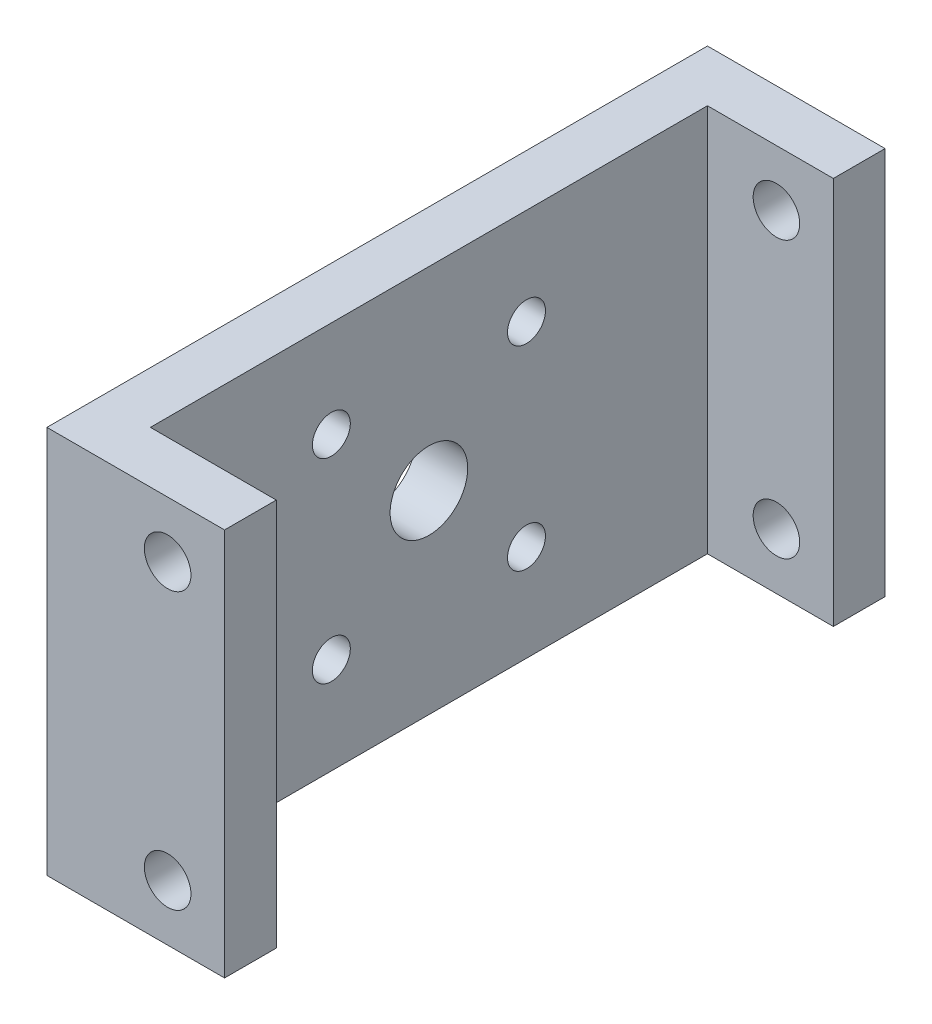
ISO-10303-21;
HEADER;
FILE_DESCRIPTION(('STEP AP214'),'2;1');
FILE_NAME('part.step','',(''),(''),'','','');
FILE_SCHEMA(('AUTOMOTIVE_DESIGN { 1 0 10303 214 1 1 1 1 }'));
ENDSEC;
DATA;
#1=APPLICATION_CONTEXT('core data for automotive mechanical design processes');
#2=APPLICATION_PROTOCOL_DEFINITION('international standard','automotive_design',2000,#1);
#3=PRODUCT_CONTEXT('',#1,'mechanical');
#4=PRODUCT('Part','Part','',(#3));
#5=PRODUCT_RELATED_PRODUCT_CATEGORY('part','',(#4));
#6=PRODUCT_DEFINITION_FORMATION('','',#4);
#7=PRODUCT_DEFINITION_CONTEXT('part definition',#1,'design');
#8=PRODUCT_DEFINITION('design','',#6,#7);
#9=PRODUCT_DEFINITION_SHAPE('','',#8);
#10=(LENGTH_UNIT() NAMED_UNIT(*) SI_UNIT(.MILLI.,.METRE.));
#11=(NAMED_UNIT(*) PLANE_ANGLE_UNIT() SI_UNIT($,.RADIAN.));
#12=(NAMED_UNIT(*) SI_UNIT($,.STERADIAN.) SOLID_ANGLE_UNIT());
#13=UNCERTAINTY_MEASURE_WITH_UNIT(LENGTH_MEASURE(1.E-05),#10,'distance_accuracy_value','');
#14=(GEOMETRIC_REPRESENTATION_CONTEXT(3) GLOBAL_UNCERTAINTY_ASSIGNED_CONTEXT((#13)) GLOBAL_UNIT_ASSIGNED_CONTEXT((#10,
#11,#12)) REPRESENTATION_CONTEXT('',''));
#15=CARTESIAN_POINT('',(0.,0.,0.));
#16=DIRECTION('',(0.,0.,1.));
#17=DIRECTION('',(1.,0.,0.));
#18=AXIS2_PLACEMENT_3D('',#15,#16,#17);
#19=CARTESIAN_POINT('',(3.,11.25,0.));
#20=DIRECTION('',(0.,1.,0.));
#21=DIRECTION('',(0.,0.,1.));
#22=AXIS2_PLACEMENT_3D('',#19,#20,#21);
#23=PLANE('',#22);
#24=DIRECTION('',(0.,0.,-1.));
#25=VECTOR('',#24,1.);
#26=CARTESIAN_POINT('',(0.,11.25,0.));
#27=LINE('',#26,#25);
#28=CARTESIAN_POINT('',(0.,11.25,19.15));
#29=VERTEX_POINT('',#28);
#30=CARTESIAN_POINT('',(0.,11.25,-19.15));
#31=VERTEX_POINT('',#30);
#32=EDGE_CURVE('E189',#29,#31,#27,.T.);
#33=ORIENTED_EDGE('',*,*,#32,.F.);
#34=DIRECTION('',(-1.,0.,0.));
#35=VECTOR('',#34,1.);
#36=CARTESIAN_POINT('',(10.3,11.25,19.15));
#37=LINE('',#36,#35);
#38=CARTESIAN_POINT('',(10.3,11.25,19.15));
#39=VERTEX_POINT('',#38);
#40=EDGE_CURVE('E396',#39,#29,#37,.T.);
#41=ORIENTED_EDGE('',*,*,#40,.F.);
#42=DIRECTION('',(0.,0.,-1.));
#43=VECTOR('',#42,1.);
#44=CARTESIAN_POINT('',(10.3,11.25,0.));
#45=LINE('',#44,#43);
#46=CARTESIAN_POINT('',(10.3,11.25,16.15));
#47=VERTEX_POINT('',#46);
#48=EDGE_CURVE('E118',#39,#47,#45,.T.);
#49=ORIENTED_EDGE('',*,*,#48,.T.);
#50=DIRECTION('',(-1.,0.,0.));
#51=VECTOR('',#50,1.);
#52=CARTESIAN_POINT('',(10.3,11.25,16.15));
#53=LINE('',#52,#51);
#54=CARTESIAN_POINT('',(3.,11.25,16.15));
#55=VERTEX_POINT('',#54);
#56=EDGE_CURVE('E130',#47,#55,#53,.T.);
#57=ORIENTED_EDGE('',*,*,#56,.T.);
#58=DIRECTION('',(0.,0.,-1.));
#59=VECTOR('',#58,1.);
#60=CARTESIAN_POINT('',(3.,11.25,0.));
#61=LINE('',#60,#59);
#62=CARTESIAN_POINT('',(3.,11.25,-16.15));
#63=VERTEX_POINT('',#62);
#64=EDGE_CURVE('E172',#55,#63,#61,.T.);
#65=ORIENTED_EDGE('',*,*,#64,.T.);
#66=DIRECTION('',(-1.,0.,0.));
#67=VECTOR('',#66,1.);
#68=CARTESIAN_POINT('',(10.3,11.25,-16.15));
#69=LINE('',#68,#67);
#70=CARTESIAN_POINT('',(10.3,11.25,-16.15));
#71=VERTEX_POINT('',#70);
#72=EDGE_CURVE('E152',#71,#63,#69,.T.);
#73=ORIENTED_EDGE('',*,*,#72,.F.);
#74=DIRECTION('',(0.,0.,-1.));
#75=VECTOR('',#74,1.);
#76=CARTESIAN_POINT('',(10.3,11.25,0.));
#77=LINE('',#76,#75);
#78=CARTESIAN_POINT('',(10.3,11.25,-19.15));
#79=VERTEX_POINT('',#78);
#80=EDGE_CURVE('E128',#71,#79,#77,.T.);
#81=ORIENTED_EDGE('',*,*,#80,.T.);
#82=DIRECTION('',(-1.,0.,0.));
#83=VECTOR('',#82,1.);
#84=CARTESIAN_POINT('',(10.3,11.25,-19.15));
#85=LINE('',#84,#83);
#86=EDGE_CURVE('E142',#79,#31,#85,.T.);
#87=ORIENTED_EDGE('',*,*,#86,.T.);
#88=EDGE_LOOP('',(#33,#41,#49,#57,#65,#73,#81,#87));
#89=FACE_BOUND('',#88,.T.);
#90=ADVANCED_FACE('F36',(#89),#23,.T.);
#91=CARTESIAN_POINT('',(3.,5.65685424949235,-5.65685424949241));
#92=DIRECTION('',(-1.,0.,0.));
#93=DIRECTION('',(0.,0.,1.));
#94=AXIS2_PLACEMENT_3D('',#91,#92,#93);
#95=CYLINDRICAL_SURFACE('',#94,1.1);
#96=CARTESIAN_POINT('',(3.,5.65685424949235,-5.65685424949241));
#97=DIRECTION('',(1.,0.,0.));
#98=DIRECTION('',(0.,0.,-1.));
#99=AXIS2_PLACEMENT_3D('',#96,#97,#98);
#100=CIRCLE('',#99,1.1);
#101=CARTESIAN_POINT('',(3.,5.65685424949235,-6.75685424949241));
#102=VERTEX_POINT('',#101);
#103=EDGE_CURVE('E168',#102,#102,#100,.T.);
#104=ORIENTED_EDGE('',*,*,#103,.T.);
#105=EDGE_LOOP('',(#104));
#106=FACE_BOUND('',#105,.T.);
#107=CARTESIAN_POINT('',(0.,5.65685424949235,-5.65685424949241));
#108=DIRECTION('',(1.,0.,0.));
#109=DIRECTION('',(0.,0.,-1.));
#110=AXIS2_PLACEMENT_3D('',#107,#108,#109);
#111=CIRCLE('',#110,1.1);
#112=CARTESIAN_POINT('',(0.,5.65685424949235,-6.75685424949241));
#113=VERTEX_POINT('',#112);
#114=EDGE_CURVE('E187',#113,#113,#111,.T.);
#115=ORIENTED_EDGE('',*,*,#114,.F.);
#116=EDGE_LOOP('',(#115));
#117=FACE_BOUND('',#116,.T.);
#118=ADVANCED_FACE('F214',(#106,#117),#95,.F.);
#119=CARTESIAN_POINT('',(3.,0.,0.));
#120=DIRECTION('',(-1.,0.,0.));
#121=DIRECTION('',(0.,0.,1.));
#122=AXIS2_PLACEMENT_3D('',#119,#120,#121);
#123=CYLINDRICAL_SURFACE('',#122,2.25);
#124=CARTESIAN_POINT('',(3.,0.,0.));
#125=DIRECTION('',(1.,0.,0.));
#126=DIRECTION('',(0.,0.,-1.));
#127=AXIS2_PLACEMENT_3D('',#124,#125,#126);
#128=CIRCLE('',#127,2.25);
#129=CARTESIAN_POINT('',(3.,0.,-2.25));
#130=VERTEX_POINT('',#129);
#131=EDGE_CURVE('E165',#130,#130,#128,.T.);
#132=ORIENTED_EDGE('',*,*,#131,.T.);
#133=EDGE_LOOP('',(#132));
#134=FACE_BOUND('',#133,.T.);
#135=CARTESIAN_POINT('',(0.,0.,0.));
#136=DIRECTION('',(1.,0.,0.));
#137=DIRECTION('',(0.,0.,-1.));
#138=AXIS2_PLACEMENT_3D('',#135,#136,#137);
#139=CIRCLE('',#138,2.25);
#140=CARTESIAN_POINT('',(0.,0.,-2.25));
#141=VERTEX_POINT('',#140);
#142=EDGE_CURVE('E184',#141,#141,#139,.T.);
#143=ORIENTED_EDGE('',*,*,#142,.F.);
#144=EDGE_LOOP('',(#143));
#145=FACE_BOUND('',#144,.T.);
#146=ADVANCED_FACE('F220',(#134,#145),#123,.F.);
#147=CARTESIAN_POINT('',(3.,-5.65685424949241,-5.65685424949266));
#148=DIRECTION('',(-1.,0.,0.));
#149=DIRECTION('',(0.,0.,1.));
#150=AXIS2_PLACEMENT_3D('',#147,#148,#149);
#151=CYLINDRICAL_SURFACE('',#150,1.1);
#152=CARTESIAN_POINT('',(3.,-5.65685424949241,-5.65685424949266));
#153=DIRECTION('',(1.,0.,0.));
#154=DIRECTION('',(0.,0.,-1.));
#155=AXIS2_PLACEMENT_3D('',#152,#153,#154);
#156=CIRCLE('',#155,1.1);
#157=CARTESIAN_POINT('',(3.,-5.65685424949241,-6.75685424949266));
#158=VERTEX_POINT('',#157);
#159=EDGE_CURVE('E162',#158,#158,#156,.T.);
#160=ORIENTED_EDGE('',*,*,#159,.T.);
#161=EDGE_LOOP('',(#160));
#162=FACE_BOUND('',#161,.T.);
#163=CARTESIAN_POINT('',(0.,-5.65685424949241,-5.65685424949266));
#164=DIRECTION('',(1.,0.,0.));
#165=DIRECTION('',(0.,0.,-1.));
#166=AXIS2_PLACEMENT_3D('',#163,#164,#165);
#167=CIRCLE('',#166,1.1);
#168=CARTESIAN_POINT('',(0.,-5.65685424949241,-6.75685424949266));
#169=VERTEX_POINT('',#168);
#170=EDGE_CURVE('E181',#169,#169,#167,.T.);
#171=ORIENTED_EDGE('',*,*,#170,.F.);
#172=EDGE_LOOP('',(#171));
#173=FACE_BOUND('',#172,.T.);
#174=ADVANCED_FACE('F226',(#162,#173),#151,.F.);
#175=CARTESIAN_POINT('',(3.,-5.65685424949266,5.6568542494921));
#176=DIRECTION('',(-1.,0.,0.));
#177=DIRECTION('',(0.,0.,1.));
#178=AXIS2_PLACEMENT_3D('',#175,#176,#177);
#179=CYLINDRICAL_SURFACE('',#178,1.1);
#180=CARTESIAN_POINT('',(3.,-5.65685424949266,5.6568542494921));
#181=DIRECTION('',(1.,0.,0.));
#182=DIRECTION('',(0.,0.,-1.));
#183=AXIS2_PLACEMENT_3D('',#180,#181,#182);
#184=CIRCLE('',#183,1.1);
#185=CARTESIAN_POINT('',(3.,-5.65685424949266,4.5568542494921));
#186=VERTEX_POINT('',#185);
#187=EDGE_CURVE('E159',#186,#186,#184,.T.);
#188=ORIENTED_EDGE('',*,*,#187,.T.);
#189=EDGE_LOOP('',(#188));
#190=FACE_BOUND('',#189,.T.);
#191=CARTESIAN_POINT('',(0.,-5.65685424949266,5.6568542494921));
#192=DIRECTION('',(1.,0.,0.));
#193=DIRECTION('',(0.,0.,-1.));
#194=AXIS2_PLACEMENT_3D('',#191,#192,#193);
#195=CIRCLE('',#194,1.1);
#196=CARTESIAN_POINT('',(0.,-5.65685424949266,4.5568542494921));
#197=VERTEX_POINT('',#196);
#198=EDGE_CURVE('E178',#197,#197,#195,.T.);
#199=ORIENTED_EDGE('',*,*,#198,.F.);
#200=EDGE_LOOP('',(#199));
#201=FACE_BOUND('',#200,.T.);
#202=ADVANCED_FACE('F229',(#190,#201),#179,.F.);
#203=CARTESIAN_POINT('',(3.,5.6568542494921,5.65685424949235));
#204=DIRECTION('',(-1.,0.,0.));
#205=DIRECTION('',(0.,0.,1.));
#206=AXIS2_PLACEMENT_3D('',#203,#204,#205);
#207=CYLINDRICAL_SURFACE('',#206,1.1);
#208=CARTESIAN_POINT('',(3.,5.6568542494921,5.65685424949235));
#209=DIRECTION('',(1.,0.,0.));
#210=DIRECTION('',(0.,0.,-1.));
#211=AXIS2_PLACEMENT_3D('',#208,#209,#210);
#212=CIRCLE('',#211,1.1);
#213=CARTESIAN_POINT('',(3.,5.6568542494921,4.55685424949235));
#214=VERTEX_POINT('',#213);
#215=EDGE_CURVE('E156',#214,#214,#212,.T.);
#216=ORIENTED_EDGE('',*,*,#215,.T.);
#217=EDGE_LOOP('',(#216));
#218=FACE_BOUND('',#217,.T.);
#219=CARTESIAN_POINT('',(0.,5.6568542494921,5.65685424949235));
#220=DIRECTION('',(1.,0.,0.));
#221=DIRECTION('',(0.,0.,-1.));
#222=AXIS2_PLACEMENT_3D('',#219,#220,#221);
#223=CIRCLE('',#222,1.1);
#224=CARTESIAN_POINT('',(0.,5.6568542494921,4.55685424949235));
#225=VERTEX_POINT('',#224);
#226=EDGE_CURVE('E155',#225,#225,#223,.T.);
#227=ORIENTED_EDGE('',*,*,#226,.F.);
#228=EDGE_LOOP('',(#227));
#229=FACE_BOUND('',#228,.T.);
#230=ADVANCED_FACE('F38',(#218,#229),#207,.F.);
#231=CARTESIAN_POINT('',(3.,-11.25,0.));
#232=DIRECTION('',(0.,1.,0.));
#233=DIRECTION('',(0.,0.,1.));
#234=AXIS2_PLACEMENT_3D('',#231,#232,#233);
#235=PLANE('',#234);
#236=DIRECTION('',(0.,0.,-1.));
#237=VECTOR('',#236,1.);
#238=CARTESIAN_POINT('',(0.,-11.25,0.));
#239=LINE('',#238,#237);
#240=CARTESIAN_POINT('',(0.,-11.25,19.15));
#241=VERTEX_POINT('',#240);
#242=CARTESIAN_POINT('',(0.,-11.25,-19.15));
#243=VERTEX_POINT('',#242);
#244=EDGE_CURVE('E40',#241,#243,#239,.T.);
#245=ORIENTED_EDGE('',*,*,#244,.T.);
#246=DIRECTION('',(-1.,0.,0.));
#247=VECTOR('',#246,1.);
#248=CARTESIAN_POINT('',(10.3,-11.25,-19.15));
#249=LINE('',#248,#247);
#250=CARTESIAN_POINT('',(10.3,-11.25,-19.15));
#251=VERTEX_POINT('',#250);
#252=EDGE_CURVE('E146',#251,#243,#249,.T.);
#253=ORIENTED_EDGE('',*,*,#252,.F.);
#254=DIRECTION('',(0.,0.,-1.));
#255=VECTOR('',#254,1.);
#256=CARTESIAN_POINT('',(10.3,-11.25,0.));
#257=LINE('',#256,#255);
#258=CARTESIAN_POINT('',(10.3,-11.25,-16.15));
#259=VERTEX_POINT('',#258);
#260=EDGE_CURVE('E138',#259,#251,#257,.T.);
#261=ORIENTED_EDGE('',*,*,#260,.F.);
#262=DIRECTION('',(-1.,0.,0.));
#263=VECTOR('',#262,1.);
#264=CARTESIAN_POINT('',(10.3,-11.25,-16.15));
#265=LINE('',#264,#263);
#266=CARTESIAN_POINT('',(3.,-11.25,-16.15));
#267=VERTEX_POINT('',#266);
#268=EDGE_CURVE('E149',#259,#267,#265,.T.);
#269=ORIENTED_EDGE('',*,*,#268,.T.);
#270=DIRECTION('',(0.,0.,-1.));
#271=VECTOR('',#270,1.);
#272=CARTESIAN_POINT('',(3.,-11.25,0.));
#273=LINE('',#272,#271);
#274=CARTESIAN_POINT('',(3.,-11.25,16.15));
#275=VERTEX_POINT('',#274);
#276=EDGE_CURVE('E11',#275,#267,#273,.T.);
#277=ORIENTED_EDGE('',*,*,#276,.F.);
#278=DIRECTION('',(-1.,0.,0.));
#279=VECTOR('',#278,1.);
#280=CARTESIAN_POINT('',(10.3,-11.25,16.15));
#281=LINE('',#280,#279);
#282=CARTESIAN_POINT('',(10.3,-11.25,16.15));
#283=VERTEX_POINT('',#282);
#284=EDGE_CURVE('E53',#283,#275,#281,.T.);
#285=ORIENTED_EDGE('',*,*,#284,.F.);
#286=DIRECTION('',(0.,0.,-1.));
#287=VECTOR('',#286,1.);
#288=CARTESIAN_POINT('',(10.3,-11.25,0.));
#289=LINE('',#288,#287);
#290=CARTESIAN_POINT('',(10.3,-11.25,19.15));
#291=VERTEX_POINT('',#290);
#292=EDGE_CURVE('E103',#291,#283,#289,.T.);
#293=ORIENTED_EDGE('',*,*,#292,.F.);
#294=DIRECTION('',(-1.,0.,0.));
#295=VECTOR('',#294,1.);
#296=CARTESIAN_POINT('',(10.3,-11.25,19.15));
#297=LINE('',#296,#295);
#298=EDGE_CURVE('E107',#291,#241,#297,.T.);
#299=ORIENTED_EDGE('',*,*,#298,.T.);
#300=EDGE_LOOP('',(#245,#253,#261,#269,#277,#285,#293,#299));
#301=FACE_BOUND('',#300,.T.);
#302=ADVANCED_FACE('F105',(#301),#235,.F.);
#303=CARTESIAN_POINT('',(3.,0.,0.));
#304=DIRECTION('',(1.,0.,0.));
#305=DIRECTION('',(0.,0.,-1.));
#306=AXIS2_PLACEMENT_3D('',#303,#304,#305);
#307=PLANE('',#306);
#308=ORIENTED_EDGE('',*,*,#215,.F.);
#309=EDGE_LOOP('',(#308));
#310=FACE_BOUND('',#309,.T.);
#311=ORIENTED_EDGE('',*,*,#187,.F.);
#312=EDGE_LOOP('',(#311));
#313=FACE_BOUND('',#312,.T.);
#314=ORIENTED_EDGE('',*,*,#159,.F.);
#315=EDGE_LOOP('',(#314));
#316=FACE_BOUND('',#315,.T.);
#317=ORIENTED_EDGE('',*,*,#131,.F.);
#318=EDGE_LOOP('',(#317));
#319=FACE_BOUND('',#318,.T.);
#320=ORIENTED_EDGE('',*,*,#103,.F.);
#321=EDGE_LOOP('',(#320));
#322=FACE_BOUND('',#321,.T.);
#323=DIRECTION('',(0.,-1.,0.));
#324=VECTOR('',#323,1.);
#325=CARTESIAN_POINT('',(3.,0.,-16.15));
#326=LINE('',#325,#324);
#327=EDGE_CURVE('E60',#63,#267,#326,.T.);
#328=ORIENTED_EDGE('',*,*,#327,.F.);
#329=ORIENTED_EDGE('',*,*,#64,.F.);
#330=DIRECTION('',(0.,-1.,0.));
#331=VECTOR('',#330,1.);
#332=CARTESIAN_POINT('',(3.,0.,16.15));
#333=LINE('',#332,#331);
#334=EDGE_CURVE('E45',#55,#275,#333,.T.);
#335=ORIENTED_EDGE('',*,*,#334,.T.);
#336=ORIENTED_EDGE('',*,*,#276,.T.);
#337=EDGE_LOOP('',(#328,#329,#335,#336));
#338=FACE_BOUND('',#337,.T.);
#339=ADVANCED_FACE('F200',(#310,#313,#316,#319,#322,#338),#307,.T.);
#340=CARTESIAN_POINT('',(0.,0.,0.));
#341=DIRECTION('',(1.,0.,0.));
#342=DIRECTION('',(0.,0.,-1.));
#343=AXIS2_PLACEMENT_3D('',#340,#341,#342);
#344=PLANE('',#343);
#345=ORIENTED_EDGE('',*,*,#226,.T.);
#346=EDGE_LOOP('',(#345));
#347=FACE_BOUND('',#346,.T.);
#348=ORIENTED_EDGE('',*,*,#198,.T.);
#349=EDGE_LOOP('',(#348));
#350=FACE_BOUND('',#349,.T.);
#351=ORIENTED_EDGE('',*,*,#170,.T.);
#352=EDGE_LOOP('',(#351));
#353=FACE_BOUND('',#352,.T.);
#354=ORIENTED_EDGE('',*,*,#142,.T.);
#355=EDGE_LOOP('',(#354));
#356=FACE_BOUND('',#355,.T.);
#357=ORIENTED_EDGE('',*,*,#114,.T.);
#358=EDGE_LOOP('',(#357));
#359=FACE_BOUND('',#358,.T.);
#360=ORIENTED_EDGE('',*,*,#32,.T.);
#361=DIRECTION('',(0.,-1.,0.));
#362=VECTOR('',#361,1.);
#363=CARTESIAN_POINT('',(0.,0.,-19.15));
#364=LINE('',#363,#362);
#365=EDGE_CURVE('E125',#31,#243,#364,.T.);
#366=ORIENTED_EDGE('',*,*,#365,.T.);
#367=ORIENTED_EDGE('',*,*,#244,.F.);
#368=DIRECTION('',(0.,-1.,0.));
#369=VECTOR('',#368,1.);
#370=CARTESIAN_POINT('',(0.,0.,19.15));
#371=LINE('',#370,#369);
#372=EDGE_CURVE('E121',#29,#241,#371,.T.);
#373=ORIENTED_EDGE('',*,*,#372,.F.);
#374=EDGE_LOOP('',(#360,#366,#367,#373));
#375=FACE_BOUND('',#374,.T.);
#376=ADVANCED_FACE('F197',(#347,#350,#353,#356,#359,#375),#344,.F.);
#377=CARTESIAN_POINT('',(10.3,0.,-16.15));
#378=DIRECTION('',(0.,0.,-1.));
#379=DIRECTION('',(0.,1.,0.));
#380=AXIS2_PLACEMENT_3D('',#377,#378,#379);
#381=PLANE('',#380);
#382=CARTESIAN_POINT('',(7.,-8.,-16.15));
#383=DIRECTION('',(0.,0.,-1.));
#384=DIRECTION('',(0.,1.,0.));
#385=AXIS2_PLACEMENT_3D('',#382,#383,#384);
#386=CIRCLE('',#385,1.35);
#387=CARTESIAN_POINT('',(8.35,-8.,-16.15));
#388=VERTEX_POINT('',#387);
#389=EDGE_CURVE('E375',#388,#388,#386,.F.);
#390=ORIENTED_EDGE('',*,*,#389,.F.);
#391=EDGE_LOOP('',(#390));
#392=FACE_BOUND('',#391,.T.);
#393=CARTESIAN_POINT('',(7.,8.,-16.15));
#394=DIRECTION('',(0.,0.,-1.));
#395=DIRECTION('',(0.,1.,0.));
#396=AXIS2_PLACEMENT_3D('',#393,#394,#395);
#397=CIRCLE('',#396,1.35);
#398=CARTESIAN_POINT('',(8.35,8.,-16.15));
#399=VERTEX_POINT('',#398);
#400=EDGE_CURVE('E391',#399,#399,#397,.T.);
#401=ORIENTED_EDGE('',*,*,#400,.T.);
#402=EDGE_LOOP('',(#401));
#403=FACE_BOUND('',#402,.T.);
#404=ORIENTED_EDGE('',*,*,#72,.T.);
#405=ORIENTED_EDGE('',*,*,#327,.T.);
#406=ORIENTED_EDGE('',*,*,#268,.F.);
#407=DIRECTION('',(0.,-1.,0.));
#408=VECTOR('',#407,1.);
#409=CARTESIAN_POINT('',(10.3,0.,-16.15));
#410=LINE('',#409,#408);
#411=EDGE_CURVE('E136',#71,#259,#410,.T.);
#412=ORIENTED_EDGE('',*,*,#411,.F.);
#413=EDGE_LOOP('',(#404,#405,#406,#412));
#414=FACE_BOUND('',#413,.T.);
#415=ADVANCED_FACE('F199',(#392,#403,#414),#381,.F.);
#416=CARTESIAN_POINT('',(10.3,0.,-19.15));
#417=DIRECTION('',(0.,0.,-1.));
#418=DIRECTION('',(-1.,0.,0.));
#419=AXIS2_PLACEMENT_3D('',#416,#417,#418);
#420=PLANE('',#419);
#421=CARTESIAN_POINT('',(7.,-8.,-19.15));
#422=DIRECTION('',(0.,0.,-1.));
#423=DIRECTION('',(-1.,0.,0.));
#424=AXIS2_PLACEMENT_3D('',#421,#422,#423);
#425=CIRCLE('',#424,1.35);
#426=CARTESIAN_POINT('',(8.35,-8.,-19.15));
#427=VERTEX_POINT('',#426);
#428=EDGE_CURVE('E372',#427,#427,#425,.T.);
#429=ORIENTED_EDGE('',*,*,#428,.F.);
#430=EDGE_LOOP('',(#429));
#431=FACE_BOUND('',#430,.T.);
#432=CARTESIAN_POINT('',(7.,8.,-19.15));
#433=DIRECTION('',(0.,0.,-1.));
#434=DIRECTION('',(-1.,0.,0.));
#435=AXIS2_PLACEMENT_3D('',#432,#433,#434);
#436=CIRCLE('',#435,1.35);
#437=CARTESIAN_POINT('',(8.35,8.,-19.15));
#438=VERTEX_POINT('',#437);
#439=EDGE_CURVE('E380',#438,#438,#436,.F.);
#440=ORIENTED_EDGE('',*,*,#439,.T.);
#441=EDGE_LOOP('',(#440));
#442=FACE_BOUND('',#441,.T.);
#443=ORIENTED_EDGE('',*,*,#365,.F.);
#444=ORIENTED_EDGE('',*,*,#86,.F.);
#445=DIRECTION('',(0.,-1.,0.));
#446=VECTOR('',#445,1.);
#447=CARTESIAN_POINT('',(10.3,0.,-19.15));
#448=LINE('',#447,#446);
#449=EDGE_CURVE('E140',#79,#251,#448,.T.);
#450=ORIENTED_EDGE('',*,*,#449,.T.);
#451=ORIENTED_EDGE('',*,*,#252,.T.);
#452=EDGE_LOOP('',(#443,#444,#450,#451));
#453=FACE_BOUND('',#452,.T.);
#454=ADVANCED_FACE('F195',(#431,#442,#453),#420,.T.);
#455=CARTESIAN_POINT('',(10.3,0.,0.));
#456=DIRECTION('',(1.,0.,0.));
#457=DIRECTION('',(0.,0.,-1.));
#458=AXIS2_PLACEMENT_3D('',#455,#456,#457);
#459=PLANE('',#458);
#460=ORIENTED_EDGE('',*,*,#80,.F.);
#461=ORIENTED_EDGE('',*,*,#411,.T.);
#462=ORIENTED_EDGE('',*,*,#260,.T.);
#463=ORIENTED_EDGE('',*,*,#449,.F.);
#464=EDGE_LOOP('',(#460,#461,#462,#463));
#465=FACE_BOUND('',#464,.T.);
#466=ADVANCED_FACE('F281',(#465),#459,.T.);
#467=CARTESIAN_POINT('',(10.3,0.,16.15));
#468=DIRECTION('',(0.,0.,-1.));
#469=DIRECTION('',(0.,1.,0.));
#470=AXIS2_PLACEMENT_3D('',#467,#468,#469);
#471=PLANE('',#470);
#472=CARTESIAN_POINT('',(7.,-8.,16.15));
#473=DIRECTION('',(0.,0.,-1.));
#474=DIRECTION('',(0.,1.,0.));
#475=AXIS2_PLACEMENT_3D('',#472,#473,#474);
#476=CIRCLE('',#475,1.35);
#477=CARTESIAN_POINT('',(7.,-6.65,16.15));
#478=VERTEX_POINT('',#477);
#479=EDGE_CURVE('E377',#478,#478,#476,.F.);
#480=ORIENTED_EDGE('',*,*,#479,.T.);
#481=EDGE_LOOP('',(#480));
#482=FACE_BOUND('',#481,.T.);
#483=CARTESIAN_POINT('',(7.,8.,16.15));
#484=DIRECTION('',(0.,0.,-1.));
#485=DIRECTION('',(0.,1.,0.));
#486=AXIS2_PLACEMENT_3D('',#483,#484,#485);
#487=CIRCLE('',#486,1.35);
#488=CARTESIAN_POINT('',(7.,9.35,16.15));
#489=VERTEX_POINT('',#488);
#490=EDGE_CURVE('E388',#489,#489,#487,.T.);
#491=ORIENTED_EDGE('',*,*,#490,.F.);
#492=EDGE_LOOP('',(#491));
#493=FACE_BOUND('',#492,.T.);
#494=ORIENTED_EDGE('',*,*,#334,.F.);
#495=ORIENTED_EDGE('',*,*,#56,.F.);
#496=DIRECTION('',(0.,-1.,0.));
#497=VECTOR('',#496,1.);
#498=CARTESIAN_POINT('',(10.3,0.,16.15));
#499=LINE('',#498,#497);
#500=EDGE_CURVE('E111',#47,#283,#499,.T.);
#501=ORIENTED_EDGE('',*,*,#500,.T.);
#502=ORIENTED_EDGE('',*,*,#284,.T.);
#503=EDGE_LOOP('',(#494,#495,#501,#502));
#504=FACE_BOUND('',#503,.T.);
#505=ADVANCED_FACE('F286',(#482,#493,#504),#471,.T.);
#506=CARTESIAN_POINT('',(10.3,0.,19.15));
#507=DIRECTION('',(0.,0.,-1.));
#508=DIRECTION('',(0.,1.,0.));
#509=AXIS2_PLACEMENT_3D('',#506,#507,#508);
#510=PLANE('',#509);
#511=CARTESIAN_POINT('',(7.,-8.,19.15));
#512=DIRECTION('',(0.,0.,-1.));
#513=DIRECTION('',(1.,0.,0.));
#514=AXIS2_PLACEMENT_3D('',#511,#512,#513);
#515=CIRCLE('',#514,1.35);
#516=CARTESIAN_POINT('',(8.35,-8.,19.15));
#517=VERTEX_POINT('',#516);
#518=EDGE_CURVE('E414',#517,#517,#515,.T.);
#519=ORIENTED_EDGE('',*,*,#518,.T.);
#520=EDGE_LOOP('',(#519));
#521=FACE_BOUND('',#520,.T.);
#522=CARTESIAN_POINT('',(7.,8.,19.15));
#523=DIRECTION('',(0.,0.,1.));
#524=DIRECTION('',(1.,0.,0.));
#525=AXIS2_PLACEMENT_3D('',#522,#523,#524);
#526=CIRCLE('',#525,1.35);
#527=CARTESIAN_POINT('',(8.35,8.,19.15));
#528=VERTEX_POINT('',#527);
#529=EDGE_CURVE('E376',#528,#528,#526,.T.);
#530=ORIENTED_EDGE('',*,*,#529,.F.);
#531=EDGE_LOOP('',(#530));
#532=FACE_BOUND('',#531,.T.);
#533=ORIENTED_EDGE('',*,*,#372,.T.);
#534=ORIENTED_EDGE('',*,*,#298,.F.);
#535=DIRECTION('',(0.,-1.,0.));
#536=VECTOR('',#535,1.);
#537=CARTESIAN_POINT('',(10.3,0.,19.15));
#538=LINE('',#537,#536);
#539=EDGE_CURVE('E112',#39,#291,#538,.T.);
#540=ORIENTED_EDGE('',*,*,#539,.F.);
#541=ORIENTED_EDGE('',*,*,#40,.T.);
#542=EDGE_LOOP('',(#533,#534,#540,#541));
#543=FACE_BOUND('',#542,.T.);
#544=ADVANCED_FACE('F123',(#521,#532,#543),#510,.F.);
#545=CARTESIAN_POINT('',(10.3,0.,0.));
#546=DIRECTION('',(1.,0.,0.));
#547=DIRECTION('',(0.,0.,-1.));
#548=AXIS2_PLACEMENT_3D('',#545,#546,#547);
#549=PLANE('',#548);
#550=ORIENTED_EDGE('',*,*,#539,.T.);
#551=ORIENTED_EDGE('',*,*,#292,.T.);
#552=ORIENTED_EDGE('',*,*,#500,.F.);
#553=ORIENTED_EDGE('',*,*,#48,.F.);
#554=EDGE_LOOP('',(#550,#551,#552,#553));
#555=FACE_BOUND('',#554,.T.);
#556=ADVANCED_FACE('F116',(#555),#549,.T.);
#557=CARTESIAN_POINT('',(7.,8.,-22.9683766184073));
#558=DIRECTION('',(0.,0.,1.));
#559=DIRECTION('',(1.,0.,0.));
#560=AXIS2_PLACEMENT_3D('',#557,#558,#559);
#561=CYLINDRICAL_SURFACE('',#560,1.35);
#562=ORIENTED_EDGE('',*,*,#490,.T.);
#563=EDGE_LOOP('',(#562));
#564=FACE_BOUND('',#563,.T.);
#565=ORIENTED_EDGE('',*,*,#529,.T.);
#566=EDGE_LOOP('',(#565));
#567=FACE_BOUND('',#566,.T.);
#568=ADVANCED_FACE('F300',(#564,#567),#561,.F.);
#569=CARTESIAN_POINT('',(8.35,8.,-19.15));
#570=CARTESIAN_POINT('',(8.35,8.,-19.11875));
#571=CARTESIAN_POINT('',(8.35,8.,-19.0875));
#572=CARTESIAN_POINT('',(8.35,8.,-19.025));
#573=CARTESIAN_POINT('',(8.35,8.,-18.99375));
#574=CARTESIAN_POINT('',(8.35,8.,-18.93125));
#575=CARTESIAN_POINT('',(8.35,8.,-18.9));
#576=CARTESIAN_POINT('',(8.35,8.,-18.8375));
#577=CARTESIAN_POINT('',(8.35,8.,-18.80625));
#578=CARTESIAN_POINT('',(8.35,8.,-18.74375));
#579=CARTESIAN_POINT('',(8.35,8.,-18.7125));
#580=CARTESIAN_POINT('',(8.35,8.,-18.65));
#581=CARTESIAN_POINT('',(8.35,8.,-18.61875));
#582=CARTESIAN_POINT('',(8.35,8.,-18.55625));
#583=CARTESIAN_POINT('',(8.35,8.,-18.525));
#584=CARTESIAN_POINT('',(8.35,8.,-18.4625));
#585=CARTESIAN_POINT('',(8.35,8.,-18.43125));
#586=CARTESIAN_POINT('',(8.35,8.,-18.36875));
#587=CARTESIAN_POINT('',(8.35,8.,-18.3375));
#588=CARTESIAN_POINT('',(8.35,8.,-18.275));
#589=CARTESIAN_POINT('',(8.35,8.,-18.24375));
#590=CARTESIAN_POINT('',(8.35,8.,-18.18125));
#591=CARTESIAN_POINT('',(8.35,8.,-18.15));
#592=CARTESIAN_POINT('',(8.35,8.,-18.0875));
#593=CARTESIAN_POINT('',(8.35,8.,-18.05625));
#594=CARTESIAN_POINT('',(8.35,8.,-17.99375));
#595=CARTESIAN_POINT('',(8.35,8.,-17.9625));
#596=CARTESIAN_POINT('',(8.35,8.,-17.9));
#597=CARTESIAN_POINT('',(8.35,8.,-17.86875));
#598=CARTESIAN_POINT('',(8.35,8.,-17.80625));
#599=CARTESIAN_POINT('',(8.35,8.,-17.775));
#600=CARTESIAN_POINT('',(8.35,8.,-17.7125));
#601=CARTESIAN_POINT('',(8.35,8.,-17.68125));
#602=CARTESIAN_POINT('',(8.35,8.,-17.61875));
#603=CARTESIAN_POINT('',(8.35,8.,-17.5875));
#604=CARTESIAN_POINT('',(8.35,8.,-17.525));
#605=CARTESIAN_POINT('',(8.35,8.,-17.49375));
#606=CARTESIAN_POINT('',(8.35,8.,-17.43125));
#607=CARTESIAN_POINT('',(8.35,8.,-17.4));
#608=CARTESIAN_POINT('',(8.35,8.,-17.3375));
#609=CARTESIAN_POINT('',(8.35,8.,-17.30625));
#610=CARTESIAN_POINT('',(8.35,8.,-17.24375));
#611=CARTESIAN_POINT('',(8.35,8.,-17.2125));
#612=CARTESIAN_POINT('',(8.35,8.,-17.15));
#613=CARTESIAN_POINT('',(8.35,8.,-17.11875));
#614=CARTESIAN_POINT('',(8.35,8.,-17.05625));
#615=CARTESIAN_POINT('',(8.35,8.,-17.025));
#616=CARTESIAN_POINT('',(8.35,8.,-16.9625));
#617=CARTESIAN_POINT('',(8.35,8.,-16.93125));
#618=CARTESIAN_POINT('',(8.35,8.,-16.86875));
#619=CARTESIAN_POINT('',(8.35,8.,-16.8375));
#620=CARTESIAN_POINT('',(8.35,8.,-16.775));
#621=CARTESIAN_POINT('',(8.35,8.,-16.74375));
#622=CARTESIAN_POINT('',(8.35,8.,-16.68125));
#623=CARTESIAN_POINT('',(8.35,8.,-16.65));
#624=CARTESIAN_POINT('',(8.35,8.,-16.5875));
#625=CARTESIAN_POINT('',(8.35,8.,-16.55625));
#626=CARTESIAN_POINT('',(8.35,8.,-16.49375));
#627=CARTESIAN_POINT('',(8.35,8.,-16.4625));
#628=CARTESIAN_POINT('',(8.35,8.,-16.4));
#629=CARTESIAN_POINT('',(8.35,8.,-16.36875));
#630=CARTESIAN_POINT('',(8.35,8.,-16.30625));
#631=CARTESIAN_POINT('',(8.35,8.,-16.275));
#632=CARTESIAN_POINT('',(8.35,8.,-16.2125));
#633=CARTESIAN_POINT('',(8.35,8.,-16.18125));
#634=CARTESIAN_POINT('',(8.35,8.,-16.15));
#635=B_SPLINE_CURVE_WITH_KNOTS('',3,(#569,#570,#571,#572,#573,#574,#575,#576,#577,#578,#579,
#580,#581,#582,#583,#584,#585,#586,#587,#588,#589,#590,#591,#592,#593,#594,#595,#596,#597,#598,
#599,#600,#601,#602,#603,#604,#605,#606,#607,#608,#609,#610,#611,#612,#613,#614,#615,#616,#617,
#618,#619,#620,#621,#622,#623,#624,#625,#626,#627,#628,#629,#630,#631,#632,#633,#634),
.UNSPECIFIED.,.F.,.F.,(4,2,2,2,2,2,2,2,2,2,2,2,2,2,2,2,2,2,2,2,2,2,2,2,2,2,2,2,2,2,2,2,4),(0.,
0.0937500000000036,0.1875,0.281250000000004,0.375,0.468750000000004,0.562500000000004,
0.656250000000004,0.750000000000004,0.843750000000004,0.937500000000004,1.03125,1.125,1.21875,
1.3125,1.40625,1.5,1.59375,1.6875,1.78125000000001,1.87500000000001,1.96875000000001,
2.06250000000001,2.15625000000001,2.25000000000001,2.34375000000001,2.43750000000001,
2.53125000000001,2.62500000000001,2.71875000000001,2.81250000000001,2.90625000000001,
3.00000000000001),.UNSPECIFIED.);
#636=EDGE_CURVE('BSEAM311',#438,#399,#635,.T.);
#637=ORIENTED_EDGE('',*,*,#439,.F.);
#638=ORIENTED_EDGE('',*,*,#400,.F.);
#639=ORIENTED_EDGE('',*,*,#636,.T.);
#640=ORIENTED_EDGE('',*,*,#636,.F.);
#641=EDGE_LOOP('',(#637,#639,#638,#640));
#642=FACE_BOUND('',#641,.T.);
#643=ADVANCED_FACE('F311',(#642),#561,.F.);
#644=CARTESIAN_POINT('',(7.,-8.,-22.9683766184073));
#645=DIRECTION('',(0.,0.,1.));
#646=DIRECTION('',(1.,0.,0.));
#647=AXIS2_PLACEMENT_3D('',#644,#645,#646);
#648=CYLINDRICAL_SURFACE('',#647,1.35);
#649=ORIENTED_EDGE('',*,*,#479,.F.);
#650=EDGE_LOOP('',(#649));
#651=FACE_BOUND('',#650,.T.);
#652=ORIENTED_EDGE('',*,*,#518,.F.);
#653=EDGE_LOOP('',(#652));
#654=FACE_BOUND('',#653,.T.);
#655=ADVANCED_FACE('F321',(#651,#654),#648,.F.);
#656=CARTESIAN_POINT('',(8.35,-8.,-19.15));
#657=CARTESIAN_POINT('',(8.35,-8.,-19.11875));
#658=CARTESIAN_POINT('',(8.35,-8.,-19.0875));
#659=CARTESIAN_POINT('',(8.35,-8.,-19.025));
#660=CARTESIAN_POINT('',(8.35,-8.,-18.99375));
#661=CARTESIAN_POINT('',(8.35,-8.,-18.93125));
#662=CARTESIAN_POINT('',(8.35,-8.,-18.9));
#663=CARTESIAN_POINT('',(8.35,-8.,-18.8375));
#664=CARTESIAN_POINT('',(8.35,-8.,-18.80625));
#665=CARTESIAN_POINT('',(8.35,-8.,-18.74375));
#666=CARTESIAN_POINT('',(8.35,-8.,-18.7125));
#667=CARTESIAN_POINT('',(8.35,-8.,-18.65));
#668=CARTESIAN_POINT('',(8.35,-8.,-18.61875));
#669=CARTESIAN_POINT('',(8.35,-8.,-18.55625));
#670=CARTESIAN_POINT('',(8.35,-8.,-18.525));
#671=CARTESIAN_POINT('',(8.35,-8.,-18.4625));
#672=CARTESIAN_POINT('',(8.35,-8.,-18.43125));
#673=CARTESIAN_POINT('',(8.35,-8.,-18.36875));
#674=CARTESIAN_POINT('',(8.35,-8.,-18.3375));
#675=CARTESIAN_POINT('',(8.35,-8.,-18.275));
#676=CARTESIAN_POINT('',(8.35,-8.,-18.24375));
#677=CARTESIAN_POINT('',(8.35,-8.,-18.18125));
#678=CARTESIAN_POINT('',(8.35,-8.,-18.15));
#679=CARTESIAN_POINT('',(8.35,-8.,-18.0875));
#680=CARTESIAN_POINT('',(8.35,-8.,-18.05625));
#681=CARTESIAN_POINT('',(8.35,-8.,-17.99375));
#682=CARTESIAN_POINT('',(8.35,-8.,-17.9625));
#683=CARTESIAN_POINT('',(8.35,-8.,-17.9));
#684=CARTESIAN_POINT('',(8.35,-8.,-17.86875));
#685=CARTESIAN_POINT('',(8.35,-8.,-17.80625));
#686=CARTESIAN_POINT('',(8.35,-8.,-17.775));
#687=CARTESIAN_POINT('',(8.35,-8.,-17.7125));
#688=CARTESIAN_POINT('',(8.35,-8.,-17.68125));
#689=CARTESIAN_POINT('',(8.35,-8.,-17.61875));
#690=CARTESIAN_POINT('',(8.35,-8.,-17.5875));
#691=CARTESIAN_POINT('',(8.35,-8.,-17.525));
#692=CARTESIAN_POINT('',(8.35,-8.,-17.49375));
#693=CARTESIAN_POINT('',(8.35,-8.,-17.43125));
#694=CARTESIAN_POINT('',(8.35,-8.,-17.4));
#695=CARTESIAN_POINT('',(8.35,-8.,-17.3375));
#696=CARTESIAN_POINT('',(8.35,-8.,-17.30625));
#697=CARTESIAN_POINT('',(8.35,-8.,-17.24375));
#698=CARTESIAN_POINT('',(8.35,-8.,-17.2125));
#699=CARTESIAN_POINT('',(8.35,-8.,-17.15));
#700=CARTESIAN_POINT('',(8.35,-8.,-17.11875));
#701=CARTESIAN_POINT('',(8.35,-8.,-17.05625));
#702=CARTESIAN_POINT('',(8.35,-8.,-17.025));
#703=CARTESIAN_POINT('',(8.35,-8.,-16.9625));
#704=CARTESIAN_POINT('',(8.35,-8.,-16.93125));
#705=CARTESIAN_POINT('',(8.35,-8.,-16.86875));
#706=CARTESIAN_POINT('',(8.35,-8.,-16.8375));
#707=CARTESIAN_POINT('',(8.35,-8.,-16.775));
#708=CARTESIAN_POINT('',(8.35,-8.,-16.74375));
#709=CARTESIAN_POINT('',(8.35,-8.,-16.68125));
#710=CARTESIAN_POINT('',(8.35,-8.,-16.65));
#711=CARTESIAN_POINT('',(8.35,-8.,-16.5875));
#712=CARTESIAN_POINT('',(8.35,-8.,-16.55625));
#713=CARTESIAN_POINT('',(8.35,-8.,-16.49375));
#714=CARTESIAN_POINT('',(8.35,-8.,-16.4625));
#715=CARTESIAN_POINT('',(8.35,-8.,-16.4));
#716=CARTESIAN_POINT('',(8.35,-8.,-16.36875));
#717=CARTESIAN_POINT('',(8.35,-8.,-16.30625));
#718=CARTESIAN_POINT('',(8.35,-8.,-16.275));
#719=CARTESIAN_POINT('',(8.35,-8.,-16.2125));
#720=CARTESIAN_POINT('',(8.35,-8.,-16.18125));
#721=CARTESIAN_POINT('',(8.35,-8.,-16.15));
#722=B_SPLINE_CURVE_WITH_KNOTS('',3,(#656,#657,#658,#659,#660,#661,#662,#663,#664,#665,#666,
#667,#668,#669,#670,#671,#672,#673,#674,#675,#676,#677,#678,#679,#680,#681,#682,#683,#684,#685,
#686,#687,#688,#689,#690,#691,#692,#693,#694,#695,#696,#697,#698,#699,#700,#701,#702,#703,#704,
#705,#706,#707,#708,#709,#710,#711,#712,#713,#714,#715,#716,#717,#718,#719,#720,#721),
.UNSPECIFIED.,.F.,.F.,(4,2,2,2,2,2,2,2,2,2,2,2,2,2,2,2,2,2,2,2,2,2,2,2,2,2,2,2,2,2,2,2,4),(0.,
0.0937500000000036,0.1875,0.281250000000004,0.375,0.468750000000004,0.562500000000004,
0.656250000000004,0.750000000000004,0.843750000000004,0.937500000000004,1.03125,1.125,1.21875,
1.3125,1.40625,1.5,1.59375,1.6875,1.78125000000001,1.87500000000001,1.96875000000001,
2.06250000000001,2.15625000000001,2.25000000000001,2.34375000000001,2.43750000000001,
2.53125000000001,2.62500000000001,2.71875000000001,2.81250000000001,2.90625000000001,
3.00000000000001),.UNSPECIFIED.);
#723=EDGE_CURVE('BSEAM356',#427,#388,#722,.T.);
#724=ORIENTED_EDGE('',*,*,#428,.T.);
#725=ORIENTED_EDGE('',*,*,#389,.T.);
#726=ORIENTED_EDGE('',*,*,#723,.T.);
#727=ORIENTED_EDGE('',*,*,#723,.F.);
#728=EDGE_LOOP('',(#724,#726,#725,#727));
#729=FACE_BOUND('',#728,.T.);
#730=ADVANCED_FACE('F356',(#729),#648,.F.);
#731=CLOSED_SHELL('',(#90,#118,#146,#174,#202,#230,#302,#339,#376,#415,#454,#466,#505,#544,#556,
#568,#643,#655,#730));
#732=MANIFOLD_SOLID_BREP('B2',#731);
#733=ADVANCED_BREP_SHAPE_REPRESENTATION('',(#18,#732),#14);
#734=SHAPE_DEFINITION_REPRESENTATION(#9,#733);
ENDSEC;
END-ISO-10303-21;
